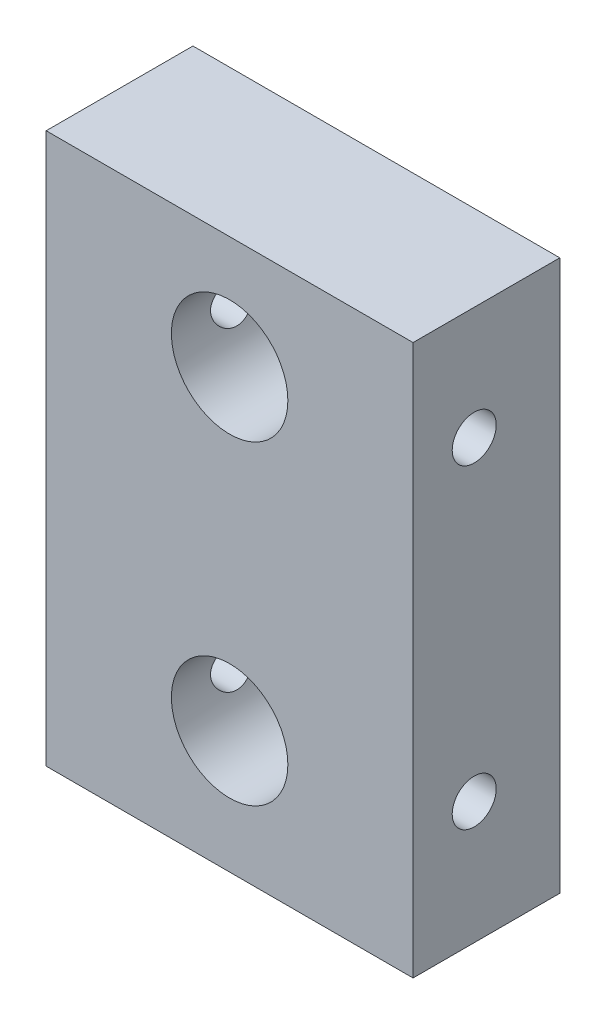
ISO-10303-21;
HEADER;
FILE_DESCRIPTION(('STEP AP214'),'2;1');
FILE_NAME('part.step','',(''),(''),'','','');
FILE_SCHEMA(('AUTOMOTIVE_DESIGN { 1 0 10303 214 1 1 1 1 }'));
ENDSEC;
DATA;
#1=APPLICATION_CONTEXT('core data for automotive mechanical design processes');
#2=APPLICATION_PROTOCOL_DEFINITION('international standard','automotive_design',2000,#1);
#3=PRODUCT_CONTEXT('',#1,'mechanical');
#4=PRODUCT('Part','Part','',(#3));
#5=PRODUCT_RELATED_PRODUCT_CATEGORY('part','',(#4));
#6=PRODUCT_DEFINITION_FORMATION('','',#4);
#7=PRODUCT_DEFINITION_CONTEXT('part definition',#1,'design');
#8=PRODUCT_DEFINITION('design','',#6,#7);
#9=PRODUCT_DEFINITION_SHAPE('','',#8);
#10=(LENGTH_UNIT() NAMED_UNIT(*) SI_UNIT(.MILLI.,.METRE.));
#11=(NAMED_UNIT(*) PLANE_ANGLE_UNIT() SI_UNIT($,.RADIAN.));
#12=(NAMED_UNIT(*) SI_UNIT($,.STERADIAN.) SOLID_ANGLE_UNIT());
#13=UNCERTAINTY_MEASURE_WITH_UNIT(LENGTH_MEASURE(1.E-05),#10,'distance_accuracy_value','');
#14=(GEOMETRIC_REPRESENTATION_CONTEXT(3) GLOBAL_UNCERTAINTY_ASSIGNED_CONTEXT((#13)) GLOBAL_UNIT_ASSIGNED_CONTEXT((#10,
#11,#12)) REPRESENTATION_CONTEXT('',''));
#15=CARTESIAN_POINT('',(0.,0.,0.));
#16=DIRECTION('',(0.,0.,1.));
#17=DIRECTION('',(1.,0.,0.));
#18=AXIS2_PLACEMENT_3D('',#15,#16,#17);
#19=CARTESIAN_POINT('',(3.76478286354874,-5.76763882139511,-184.305879912897));
#20=DIRECTION('',(0.,0.,1.));
#21=DIRECTION('',(1.,0.,0.));
#22=AXIS2_PLACEMENT_3D('',#19,#20,#21);
#23=PLANE('',#22);
#24=CARTESIAN_POINT('',(18.7647828635487,30.0023548443934,-184.305879912897));
#25=DIRECTION('',(0.,0.,1.));
#26=DIRECTION('',(1.,0.,0.));
#27=AXIS2_PLACEMENT_3D('',#24,#25,#26);
#28=CIRCLE('',#27,4.7625);
#29=CARTESIAN_POINT('',(23.5272828635487,30.0023548443934,-184.305879912897));
#30=VERTEX_POINT('',#29);
#31=EDGE_CURVE('E105',#30,#30,#28,.T.);
#32=ORIENTED_EDGE('',*,*,#31,.F.);
#33=EDGE_LOOP('',(#32));
#34=FACE_BOUND('',#33,.T.);
#35=DIRECTION('',(0.,-1.,0.));
#36=VECTOR('',#35,1.);
#37=CARTESIAN_POINT('',(3.76478286354873,39.2323611786049,-184.305879912897));
#38=LINE('',#37,#36);
#39=CARTESIAN_POINT('',(3.76478286354873,39.2323611786049,-184.305879912897));
#40=VERTEX_POINT('',#39);
#41=CARTESIAN_POINT('',(3.76478286354874,-5.76763882139511,-184.305879912897));
#42=VERTEX_POINT('',#41);
#43=EDGE_CURVE('E89',#40,#42,#38,.T.);
#44=ORIENTED_EDGE('',*,*,#43,.T.);
#45=DIRECTION('',(1.,0.,0.));
#46=VECTOR('',#45,1.);
#47=CARTESIAN_POINT('',(3.76478286354874,-5.76763882139511,-184.305879912897));
#48=LINE('',#47,#46);
#49=CARTESIAN_POINT('',(33.7647828635487,-5.76763882139511,-184.305879912897));
#50=VERTEX_POINT('',#49);
#51=EDGE_CURVE('E84',#42,#50,#48,.T.);
#52=ORIENTED_EDGE('',*,*,#51,.T.);
#53=DIRECTION('',(0.,1.,0.));
#54=VECTOR('',#53,1.);
#55=CARTESIAN_POINT('',(33.7647828635487,39.2323611786049,-184.305879912897));
#56=LINE('',#55,#54);
#57=CARTESIAN_POINT('',(33.7647828635487,39.2323611786049,-184.305879912897));
#58=VERTEX_POINT('',#57);
#59=EDGE_CURVE('E87',#50,#58,#56,.T.);
#60=ORIENTED_EDGE('',*,*,#59,.T.);
#61=DIRECTION('',(-1.,0.,0.));
#62=VECTOR('',#61,1.);
#63=CARTESIAN_POINT('',(3.76478286354873,39.2323611786049,-184.305879912897));
#64=LINE('',#63,#62);
#65=EDGE_CURVE('E54',#58,#40,#64,.T.);
#66=ORIENTED_EDGE('',*,*,#65,.T.);
#67=EDGE_LOOP('',(#44,#52,#60,#66));
#68=FACE_BOUND('',#67,.T.);
#69=CARTESIAN_POINT('',(18.7647828635477,4.23236117860423,-184.305879912897));
#70=DIRECTION('',(0.,0.,1.));
#71=DIRECTION('',(1.,0.,0.));
#72=AXIS2_PLACEMENT_3D('',#69,#70,#71);
#73=CIRCLE('',#72,4.7625);
#74=CARTESIAN_POINT('',(23.5272828635477,4.23236117860423,-184.305879912897));
#75=VERTEX_POINT('',#74);
#76=EDGE_CURVE('E181',#75,#75,#73,.T.);
#77=ORIENTED_EDGE('',*,*,#76,.F.);
#78=EDGE_LOOP('',(#77));
#79=FACE_BOUND('',#78,.T.);
#80=ADVANCED_FACE('F31',(#34,#68,#79),#23,.T.);
#81=CARTESIAN_POINT('',(3.76478286354874,-5.76763882139511,-196.305879912897));
#82=DIRECTION('',(0.,0.,1.));
#83=DIRECTION('',(1.,0.,0.));
#84=AXIS2_PLACEMENT_3D('',#81,#82,#83);
#85=PLANE('',#84);
#86=CARTESIAN_POINT('',(18.7647828635487,30.0023548443934,-196.305879912897));
#87=DIRECTION('',(0.,0.,1.));
#88=DIRECTION('',(1.,0.,0.));
#89=AXIS2_PLACEMENT_3D('',#86,#87,#88);
#90=CIRCLE('',#89,4.7625);
#91=CARTESIAN_POINT('',(23.5272828635487,30.0023548443934,-196.305879912897));
#92=VERTEX_POINT('',#91);
#93=EDGE_CURVE('E184',#92,#92,#90,.T.);
#94=ORIENTED_EDGE('',*,*,#93,.T.);
#95=EDGE_LOOP('',(#94));
#96=FACE_BOUND('',#95,.T.);
#97=DIRECTION('',(0.,-1.,0.));
#98=VECTOR('',#97,1.);
#99=CARTESIAN_POINT('',(3.76478286354873,39.2323611786049,-196.305879912897));
#100=LINE('',#99,#98);
#101=CARTESIAN_POINT('',(3.76478286354873,39.2323611786049,-196.305879912897));
#102=VERTEX_POINT('',#101);
#103=CARTESIAN_POINT('',(3.76478286354874,-5.76763882139511,-196.305879912897));
#104=VERTEX_POINT('',#103);
#105=EDGE_CURVE('E102',#102,#104,#100,.T.);
#106=ORIENTED_EDGE('',*,*,#105,.F.);
#107=DIRECTION('',(-1.,0.,0.));
#108=VECTOR('',#107,1.);
#109=CARTESIAN_POINT('',(3.76478286354873,39.2323611786049,-196.305879912897));
#110=LINE('',#109,#108);
#111=CARTESIAN_POINT('',(33.7647828635487,39.2323611786049,-196.305879912897));
#112=VERTEX_POINT('',#111);
#113=EDGE_CURVE('E77',#112,#102,#110,.T.);
#114=ORIENTED_EDGE('',*,*,#113,.F.);
#115=DIRECTION('',(0.,1.,0.));
#116=VECTOR('',#115,1.);
#117=CARTESIAN_POINT('',(33.7647828635487,39.2323611786049,-196.305879912897));
#118=LINE('',#117,#116);
#119=CARTESIAN_POINT('',(33.7647828635487,-5.76763882139511,-196.305879912897));
#120=VERTEX_POINT('',#119);
#121=EDGE_CURVE('E71',#120,#112,#118,.T.);
#122=ORIENTED_EDGE('',*,*,#121,.F.);
#123=DIRECTION('',(1.,0.,0.));
#124=VECTOR('',#123,1.);
#125=CARTESIAN_POINT('',(3.76478286354874,-5.76763882139511,-196.305879912897));
#126=LINE('',#125,#124);
#127=EDGE_CURVE('E93',#104,#120,#126,.T.);
#128=ORIENTED_EDGE('',*,*,#127,.F.);
#129=EDGE_LOOP('',(#106,#114,#122,#128));
#130=FACE_BOUND('',#129,.T.);
#131=CARTESIAN_POINT('',(18.7647828635477,4.23236117860423,-196.305879912897));
#132=DIRECTION('',(0.,0.,1.));
#133=DIRECTION('',(1.,0.,0.));
#134=AXIS2_PLACEMENT_3D('',#131,#132,#133);
#135=CIRCLE('',#134,4.7625);
#136=CARTESIAN_POINT('',(23.5272828635477,4.23236117860423,-196.305879912897));
#137=VERTEX_POINT('',#136);
#138=EDGE_CURVE('E179',#137,#137,#135,.T.);
#139=ORIENTED_EDGE('',*,*,#138,.T.);
#140=EDGE_LOOP('',(#139));
#141=FACE_BOUND('',#140,.T.);
#142=ADVANCED_FACE('F150',(#96,#130,#141),#85,.F.);
#143=CARTESIAN_POINT('',(3.76478286354873,39.2323611786049,-184.305879912897));
#144=DIRECTION('',(1.,0.,0.));
#145=DIRECTION('',(0.,1.,0.));
#146=AXIS2_PLACEMENT_3D('',#143,#144,#145);
#147=PLANE('',#146);
#148=CARTESIAN_POINT('',(3.76478286354873,30.0023611786049,-189.305879912897));
#149=DIRECTION('',(-1.,0.,0.));
#150=DIRECTION('',(0.,0.,1.));
#151=AXIS2_PLACEMENT_3D('',#148,#149,#150);
#152=CIRCLE('',#151,1.8);
#153=CARTESIAN_POINT('',(3.76478286354873,30.0023611786049,-187.505879912897));
#154=VERTEX_POINT('',#153);
#155=EDGE_CURVE('E169',#154,#154,#152,.T.);
#156=ORIENTED_EDGE('',*,*,#155,.F.);
#157=EDGE_LOOP('',(#156));
#158=FACE_BOUND('',#157,.T.);
#159=CARTESIAN_POINT('',(3.76478286354874,4.23236117860488,-189.305879912897));
#160=DIRECTION('',(-1.,0.,0.));
#161=DIRECTION('',(0.,0.,1.));
#162=AXIS2_PLACEMENT_3D('',#159,#160,#161);
#163=CIRCLE('',#162,1.8);
#164=CARTESIAN_POINT('',(3.76478286354874,4.23236117860488,-187.505879912897));
#165=VERTEX_POINT('',#164);
#166=EDGE_CURVE('E173',#165,#165,#163,.T.);
#167=ORIENTED_EDGE('',*,*,#166,.F.);
#168=EDGE_LOOP('',(#167));
#169=FACE_BOUND('',#168,.T.);
#170=ORIENTED_EDGE('',*,*,#105,.T.);
#171=DIRECTION('',(0.,0.,-1.));
#172=VECTOR('',#171,1.);
#173=CARTESIAN_POINT('',(3.76478286354874,-5.76763882139511,-184.305879912897));
#174=LINE('',#173,#172);
#175=EDGE_CURVE('E11',#42,#104,#174,.T.);
#176=ORIENTED_EDGE('',*,*,#175,.F.);
#177=ORIENTED_EDGE('',*,*,#43,.F.);
#178=DIRECTION('',(0.,0.,-1.));
#179=VECTOR('',#178,1.);
#180=CARTESIAN_POINT('',(3.76478286354873,39.2323611786049,-184.305879912897));
#181=LINE('',#180,#179);
#182=EDGE_CURVE('E98',#40,#102,#181,.T.);
#183=ORIENTED_EDGE('',*,*,#182,.T.);
#184=EDGE_LOOP('',(#170,#176,#177,#183));
#185=FACE_BOUND('',#184,.T.);
#186=ADVANCED_FACE('F33',(#158,#169,#185),#147,.F.);
#187=CARTESIAN_POINT('',(3.76478286354874,-5.76763882139511,-184.305879912897));
#188=DIRECTION('',(0.,1.,0.));
#189=DIRECTION('',(0.,0.,1.));
#190=AXIS2_PLACEMENT_3D('',#187,#188,#189);
#191=PLANE('',#190);
#192=ORIENTED_EDGE('',*,*,#127,.T.);
#193=DIRECTION('',(0.,0.,-1.));
#194=VECTOR('',#193,1.);
#195=CARTESIAN_POINT('',(33.7647828635487,-5.76763882139511,-184.305879912897));
#196=LINE('',#195,#194);
#197=EDGE_CURVE('E45',#50,#120,#196,.T.);
#198=ORIENTED_EDGE('',*,*,#197,.F.);
#199=ORIENTED_EDGE('',*,*,#51,.F.);
#200=ORIENTED_EDGE('',*,*,#175,.T.);
#201=EDGE_LOOP('',(#192,#198,#199,#200));
#202=FACE_BOUND('',#201,.T.);
#203=ADVANCED_FACE('F92',(#202),#191,.F.);
#204=CARTESIAN_POINT('',(33.7647828635487,39.2323611786049,-184.305879912897));
#205=DIRECTION('',(-1.,0.,0.));
#206=DIRECTION('',(0.,-1.,0.));
#207=AXIS2_PLACEMENT_3D('',#204,#205,#206);
#208=PLANE('',#207);
#209=CARTESIAN_POINT('',(33.7647828635487,30.0023611786049,-189.305879912897));
#210=DIRECTION('',(-1.,0.,0.));
#211=DIRECTION('',(0.,0.,1.));
#212=AXIS2_PLACEMENT_3D('',#209,#210,#211);
#213=CIRCLE('',#212,1.8);
#214=CARTESIAN_POINT('',(33.7647828635487,30.0023611786049,-187.505879912897));
#215=VERTEX_POINT('',#214);
#216=EDGE_CURVE('E140',#215,#215,#213,.T.);
#217=ORIENTED_EDGE('',*,*,#216,.T.);
#218=EDGE_LOOP('',(#217));
#219=FACE_BOUND('',#218,.T.);
#220=CARTESIAN_POINT('',(33.7647828635487,4.23236117860488,-189.305879912897));
#221=DIRECTION('',(-1.,0.,0.));
#222=DIRECTION('',(0.,0.,1.));
#223=AXIS2_PLACEMENT_3D('',#220,#221,#222);
#224=CIRCLE('',#223,1.79999999999999);
#225=CARTESIAN_POINT('',(33.7647828635487,4.23236117860488,-187.505879912897));
#226=VERTEX_POINT('',#225);
#227=EDGE_CURVE('E119',#226,#226,#224,.T.);
#228=ORIENTED_EDGE('',*,*,#227,.T.);
#229=EDGE_LOOP('',(#228));
#230=FACE_BOUND('',#229,.T.);
#231=ORIENTED_EDGE('',*,*,#121,.T.);
#232=DIRECTION('',(0.,0.,-1.));
#233=VECTOR('',#232,1.);
#234=CARTESIAN_POINT('',(33.7647828635487,39.2323611786049,-184.305879912897));
#235=LINE('',#234,#233);
#236=EDGE_CURVE('E94',#58,#112,#235,.T.);
#237=ORIENTED_EDGE('',*,*,#236,.F.);
#238=ORIENTED_EDGE('',*,*,#59,.F.);
#239=ORIENTED_EDGE('',*,*,#197,.T.);
#240=EDGE_LOOP('',(#231,#237,#238,#239));
#241=FACE_BOUND('',#240,.T.);
#242=ADVANCED_FACE('F96',(#219,#230,#241),#208,.F.);
#243=CARTESIAN_POINT('',(3.76478286354873,39.2323611786049,-184.305879912897));
#244=DIRECTION('',(0.,-1.,0.));
#245=DIRECTION('',(1.,0.,0.));
#246=AXIS2_PLACEMENT_3D('',#243,#244,#245);
#247=PLANE('',#246);
#248=ORIENTED_EDGE('',*,*,#113,.T.);
#249=ORIENTED_EDGE('',*,*,#182,.F.);
#250=ORIENTED_EDGE('',*,*,#65,.F.);
#251=ORIENTED_EDGE('',*,*,#236,.T.);
#252=EDGE_LOOP('',(#248,#249,#250,#251));
#253=FACE_BOUND('',#252,.T.);
#254=ADVANCED_FACE('F145',(#253),#247,.F.);
#255=CARTESIAN_POINT('',(18.7647828635487,30.0023548443934,-184.305879912897));
#256=DIRECTION('',(0.,0.,-1.));
#257=DIRECTION('',(-1.,0.,0.));
#258=AXIS2_PLACEMENT_3D('',#255,#256,#257);
#259=CYLINDRICAL_SURFACE('',#258,4.7625);
#260=CARTESIAN_POINT('',(14.0022828635487,30.0023548443934,-187.505879912908));
#261=CARTESIAN_POINT('',(14.002280040065,29.9049273439229,-187.505876508423));
#262=CARTESIAN_POINT('',(14.0052983956385,29.8075253246281,-187.513815328143));
#263=CARTESIAN_POINT('',(14.0170371564296,29.6156352254887,-187.545229216947));
#264=CARTESIAN_POINT('',(14.0257566415417,29.5211466780151,-187.568701779046));
#265=CARTESIAN_POINT('',(14.0479625967678,29.3378788632292,-187.630232411416));
#266=CARTESIAN_POINT('',(14.0614397785975,29.2490888671655,-187.668262074479));
#267=CARTESIAN_POINT('',(14.0918211701919,29.0791561751348,-187.757681715223));
#268=CARTESIAN_POINT('',(14.1087263140063,28.9980155723183,-187.809075335389));
#269=CARTESIAN_POINT('',(14.1450339590226,28.8421923674234,-187.92607344201));
#270=CARTESIAN_POINT('',(14.1645079057255,28.7678824634918,-187.992151920356));
#271=CARTESIAN_POINT('',(14.2034095740135,28.6310976924185,-188.135637780218));
#272=CARTESIAN_POINT('',(14.2228372792493,28.5686265314406,-188.213048695999));
#273=CARTESIAN_POINT('',(14.2602816103805,28.4549037843292,-188.380665415829));
#274=CARTESIAN_POINT('',(14.2782141812561,28.40418188299,-188.471251258652));
#275=CARTESIAN_POINT('',(14.3095242234876,28.318859154649,-188.660451904167));
#276=CARTESIAN_POINT('',(14.3229035464216,28.2842517725651,-188.759063422955));
#277=CARTESIAN_POINT('',(14.3428274125082,28.233617102971,-188.957223462423));
#278=CARTESIAN_POINT('',(14.3496327766206,28.2168777400303,-189.056562912867));
#279=CARTESIAN_POINT('',(14.3564005970731,28.2002280406462,-189.256855987745));
#280=CARTESIAN_POINT('',(14.3563659370651,28.200310612327,-189.357808914014));
#281=CARTESIAN_POINT('',(14.3496822370228,28.2167585003298,-189.551911535459));
#282=CARTESIAN_POINT('',(14.3434364466176,28.2321311396192,-189.645161824701));
#283=CARTESIAN_POINT('',(14.3257051506646,28.2770801209457,-189.827645139333));
#284=CARTESIAN_POINT('',(14.3142188432366,28.3066586367379,-189.916877547629));
#285=CARTESIAN_POINT('',(14.2870610704548,28.3797174909451,-190.090798332025));
#286=CARTESIAN_POINT('',(14.2713138364913,28.4234526400432,-190.175367316653));
#287=CARTESIAN_POINT('',(14.2374332456151,28.5234055202229,-190.336252124382));
#288=CARTESIAN_POINT('',(14.2192990566579,28.5796276087186,-190.41256505261));
#289=CARTESIAN_POINT('',(14.1811759856307,28.707482678069,-190.560259348006));
#290=CARTESIAN_POINT('',(14.1611450565278,28.7799063807807,-190.630947047893));
#291=CARTESIAN_POINT('',(14.1225497747878,28.935808686688,-190.75938176711));
#292=CARTESIAN_POINT('',(14.1039856550194,29.0192890396145,-190.817126734331));
#293=CARTESIAN_POINT('',(14.0700361849975,29.1967269267058,-190.918818083753));
#294=CARTESIAN_POINT('',(14.0547061779658,29.2908301665829,-190.962530023656));
#295=CARTESIAN_POINT('',(14.0293636322236,29.4857785877305,-191.033271319166));
#296=CARTESIAN_POINT('',(14.0193486931241,29.5866207023852,-191.060308206452));
#297=CARTESIAN_POINT('',(14.0061884256746,29.7863489647691,-191.095590413119));
#298=CARTESIAN_POINT('',(14.0027020791969,29.8850478153809,-191.104769615847));
#299=CARTESIAN_POINT('',(14.0019356512535,30.0826259164122,-191.106799566245));
#300=CARTESIAN_POINT('',(14.0046541678835,30.1815051210396,-191.099654002272));
#301=CARTESIAN_POINT('',(14.0157672071414,30.3725789546416,-191.06994450237));
#302=CARTESIAN_POINT('',(14.0239352957754,30.4648837210912,-191.047995287947));
#303=CARTESIAN_POINT('',(14.044897481716,30.6444331643464,-190.990114042673));
#304=CARTESIAN_POINT('',(14.0576921803268,30.7316771817133,-190.954180194242));
#305=CARTESIAN_POINT('',(14.087116645214,30.9015193936799,-190.868199436857));
#306=CARTESIAN_POINT('',(14.1038485783726,30.9839040811476,-190.817766813885));
#307=CARTESIAN_POINT('',(14.1393009732442,31.1393191487236,-190.704655145805));
#308=CARTESIAN_POINT('',(14.1580221759929,31.2123460203864,-190.641971529651));
#309=CARTESIAN_POINT('',(14.1967638934131,31.3514769490049,-190.501790613518));
#310=CARTESIAN_POINT('',(14.2167959450337,31.4169191406,-190.423637883854));
#311=CARTESIAN_POINT('',(14.254839695457,31.5338943394714,-190.257070248617));
#312=CARTESIAN_POINT('',(14.2728511971148,31.5854259901859,-190.168654343376));
#313=CARTESIAN_POINT('',(14.3047500886146,31.6731979264659,-189.983275868103));
#314=CARTESIAN_POINT('',(14.3186175927191,31.7093648201747,-189.886274894064));
#315=CARTESIAN_POINT('',(14.3402191774489,31.7646088756539,-189.68688764025));
#316=CARTESIAN_POINT('',(14.3479571344957,31.7836968393979,-189.584504807808));
#317=CARTESIAN_POINT('',(14.355903267246,31.8032679293619,-189.384444707315));
#318=CARTESIAN_POINT('',(14.3565691082192,31.8048820029247,-189.286895363771));
#319=CARTESIAN_POINT('',(14.3514718927663,31.7923652996866,-189.092992693222));
#320=CARTESIAN_POINT('',(14.3457094661479,31.7782360653318,-188.996639249985));
#321=CARTESIAN_POINT('',(14.3287886209759,31.7355195673962,-188.810947542132));
#322=CARTESIAN_POINT('',(14.3178058731706,31.7074016961274,-188.721483909501));
#323=CARTESIAN_POINT('',(14.2917867456654,31.6379224193923,-188.5484935587));
#324=CARTESIAN_POINT('',(14.2767493337823,31.5965576411981,-188.464968359109));
#325=CARTESIAN_POINT('',(14.2433236049197,31.4992151178711,-188.301410310379));
#326=CARTESIAN_POINT('',(14.2247999049624,31.4425789330334,-188.221797354498));
#327=CARTESIAN_POINT('',(14.1869486015758,31.3173138948449,-188.072844502495));
#328=CARTESIAN_POINT('',(14.1676207421153,31.2486811993905,-188.003507910753));
#329=CARTESIAN_POINT('',(14.1290544560577,31.0968347373402,-187.873162568695));
#330=CARTESIAN_POINT('',(14.1098801243875,31.0130243876903,-187.812826694058));
#331=CARTESIAN_POINT('',(14.0749040126437,30.8357791253441,-187.707110903561));
#332=CARTESIAN_POINT('',(14.0591025864098,30.7423432043854,-187.661732556572));
#333=CARTESIAN_POINT('',(14.0320143109463,30.5435106992932,-187.585695562001));
#334=CARTESIAN_POINT('',(14.0209926078718,30.4377497088637,-187.555886072696));
#335=CARTESIAN_POINT('',(14.0061303518676,30.2220985028979,-187.51598531841));
#336=CARTESIAN_POINT('',(14.0022860472041,30.1122104752878,-187.505883751678));
#337=CARTESIAN_POINT('',(14.0022828635487,30.0023548443934,-187.505879912908));
#338=B_SPLINE_CURVE_WITH_KNOTS('',3,(#260,#261,#262,#263,#264,#265,#266,#267,#268,#269,#270,
#271,#272,#273,#274,#275,#276,#277,#278,#279,#280,#281,#282,#283,#284,#285,#286,#287,#288,#289,
#290,#291,#292,#293,#294,#295,#296,#297,#298,#299,#300,#301,#302,#303,#304,#305,#306,#307,#308,
#309,#310,#311,#312,#313,#314,#315,#316,#317,#318,#319,#320,#321,#322,#323,#324,#325,#326,#327,
#328,#329,#330,#331,#332,#333,#334,#335,#336,#337),.UNSPECIFIED.,.T.,.F.,(4,2,2,2,2,2,2,2,2,2,2,
2,2,2,2,2,2,2,2,2,2,2,2,2,2,2,2,2,2,2,2,2,2,2,2,2,2,2,4),(0.,0.291877239919987,
0.583707385378248,0.874970923421535,1.16631393175265,1.46896048708597,1.77170163113028,
2.08619513615856,2.40056059916426,2.70186780489485,3.00304798428122,3.28587239629844,
3.56874009934315,3.85701226782774,4.14538518961246,4.45346994456128,4.76160351275317,
5.07464519929774,5.38754538950112,5.68358881869792,5.97956536754154,6.26395183969088,
6.54837528583715,6.84120464535362,7.13414347363044,7.44435084911277,7.7545884652247,
8.0662917511568,8.37779775332487,8.66901181679856,8.96019735116507,9.24221159113761,
9.52429769048672,9.82133838314633,10.1184743834529,10.4320477347225,10.7456539657325,
11.0749360695487,11.4040460044263),.UNSPECIFIED.);
#339=CARTESIAN_POINT('',(14.0022828635487,30.0023548443934,-187.505879912908));
#340=VERTEX_POINT('',#339);
#341=EDGE_CURVE('E35',#340,#340,#338,.T.);
#342=ORIENTED_EDGE('',*,*,#341,.F.);
#343=EDGE_LOOP('',(#342));
#344=FACE_BOUND('',#343,.T.);
#345=CARTESIAN_POINT('',(23.5272828635445,30.0023611786049,-187.505879912897));
#346=CARTESIAN_POINT('',(23.5272855574211,30.0997886855794,-187.505876165588));
#347=CARTESIAN_POINT('',(23.5242670718947,30.1971907354435,-187.51381464361));
#348=CARTESIAN_POINT('',(23.512528044188,30.3890809422077,-187.5452278575));
#349=CARTESIAN_POINT('',(23.5038084221109,30.4835695667274,-187.568700086392));
#350=CARTESIAN_POINT('',(23.4816021811601,30.6668375791557,-187.630230066491));
#351=CARTESIAN_POINT('',(23.4681248506304,30.7556276957709,-187.668259410354));
#352=CARTESIAN_POINT('',(23.4377431458312,30.9255606717227,-187.757678430521));
#353=CARTESIAN_POINT('',(23.4208378375072,31.0067014379202,-187.809071749317));
#354=CARTESIAN_POINT('',(23.3845298354183,31.1625250341833,-187.926069275886));
#355=CARTESIAN_POINT('',(23.3650556950816,31.2368351658919,-187.992147478863));
#356=CARTESIAN_POINT('',(23.3261536208722,31.3736204348359,-188.135632824825));
#357=CARTESIAN_POINT('',(23.3067257033434,31.4360918658516,-188.213043502151));
#358=CARTESIAN_POINT('',(23.2692809167795,31.549815234451,-188.380659828014));
#359=CARTESIAN_POINT('',(23.2513481034286,31.6005374815065,-188.471245522488));
#360=CARTESIAN_POINT('',(23.2200375830377,31.6858609208775,-188.660445945639));
#361=CARTESIAN_POINT('',(23.2066580244119,31.7204686682848,-188.759057390371));
#362=CARTESIAN_POINT('',(23.1867337308542,31.7711040514684,-188.957217349514));
#363=CARTESIAN_POINT('',(23.1799281726281,31.7878437652695,-189.056556789535));
#364=CARTESIAN_POINT('',(23.1731600183777,31.8044941542507,-189.256849915072));
#365=CARTESIAN_POINT('',(23.1731945385889,31.804411921532,-189.357802902368));
#366=CARTESIAN_POINT('',(23.1798780349878,31.7879646751393,-189.55190557012));
#367=CARTESIAN_POINT('',(23.1861237489682,31.7725923602987,-189.645155843271));
#368=CARTESIAN_POINT('',(23.2038549515667,31.7276440358751,-189.827639176021));
#369=CARTESIAN_POINT('',(23.2153412420652,31.6980658525617,-189.916871618539));
#370=CARTESIAN_POINT('',(23.2424990362198,31.6250076992144,-190.090792458169));
#371=CARTESIAN_POINT('',(23.2582463069365,31.5812729279613,-190.175361469085));
#372=CARTESIAN_POINT('',(23.292127037269,31.4813208219732,-190.33624639014));
#373=CARTESIAN_POINT('',(23.3102613289546,31.4250991298179,-190.412559405417));
#374=CARTESIAN_POINT('',(23.3483847038659,31.2972448267184,-190.560254027518));
#375=CARTESIAN_POINT('',(23.3684158397172,31.2248214821514,-190.63094196096));
#376=CARTESIAN_POINT('',(23.4070116131703,31.0689198677227,-190.75937721304));
#377=CARTESIAN_POINT('',(23.4255760178957,30.9854398479753,-190.817122479403));
#378=CARTESIAN_POINT('',(23.4595261651186,30.8080024307441,-190.918814591972));
#379=CARTESIAN_POINT('',(23.4748565593829,30.7138993105478,-190.962526970855));
#380=CARTESIAN_POINT('',(23.5001999200844,30.5189510332452,-191.033269151902));
#381=CARTESIAN_POINT('',(23.5102152868811,30.4181089427834,-191.060306485703));
#382=CARTESIAN_POINT('',(23.5233764012797,30.2183805917051,-191.095589551408));
#383=CARTESIAN_POINT('',(23.5268631643717,30.119681632672,-191.104769162116));
#384=CARTESIAN_POINT('',(23.5276304068211,29.9221032256876,-191.106799877142));
#385=CARTESIAN_POINT('',(23.5249122881528,29.823223823551,-191.099654670003));
#386=CARTESIAN_POINT('',(23.5137999976388,29.632149673213,-191.069945820164));
#387=CARTESIAN_POINT('',(23.5056322693527,29.5398447862724,-191.047996923511));
#388=CARTESIAN_POINT('',(23.4846707669697,29.3602950457406,-190.990116276651));
#389=CARTESIAN_POINT('',(23.4718763915908,29.2730508515512,-190.954182708941));
#390=CARTESIAN_POINT('',(23.4424525557417,29.1032083649533,-190.868202540678));
#391=CARTESIAN_POINT('',(23.4257209321256,29.0208235677316,-190.817770244334));
#392=CARTESIAN_POINT('',(23.390269102516,28.8654082268489,-190.704659219398));
#393=CARTESIAN_POINT('',(23.3715481554776,28.7923811915607,-190.641975919823));
#394=CARTESIAN_POINT('',(23.3328068991359,28.6532498845551,-190.501795654221));
#395=CARTESIAN_POINT('',(23.3127750488928,28.5878074734518,-190.423643259532));
#396=CARTESIAN_POINT('',(23.2747316113145,28.4708317723261,-190.257076280815));
#397=CARTESIAN_POINT('',(23.256720221139,28.4192998390203,-190.168660696999));
#398=CARTESIAN_POINT('',(23.224821425563,28.3315272002679,-189.983282700847));
#399=CARTESIAN_POINT('',(23.2109539117566,28.2953599097681,-189.886281872126));
#400=CARTESIAN_POINT('',(23.189352218339,28.2401150391259,-189.686894844695));
#401=CARTESIAN_POINT('',(23.1816141624391,28.221026657236,-189.584512093292));
#402=CARTESIAN_POINT('',(23.1736677611199,28.2014547351581,-189.384451928134));
#403=CARTESIAN_POINT('',(23.1730017644825,28.1998402714123,-189.286902441377));
#404=CARTESIAN_POINT('',(23.1780986443259,28.2123562497552,-189.092999415246));
#405=CARTESIAN_POINT('',(23.1838608909562,28.2264851492813,-188.996645759638));
#406=CARTESIAN_POINT('',(23.2007813718544,28.2692010440185,-188.810953635937));
#407=CARTESIAN_POINT('',(23.2117639323086,28.2973186361497,-188.721489799207));
#408=CARTESIAN_POINT('',(23.23778268735,28.366797411299,-188.548499000682));
#409=CARTESIAN_POINT('',(23.2528199141078,28.4081619670158,-188.464973557437));
#410=CARTESIAN_POINT('',(23.2862452498207,28.505504029756,-188.301415093141));
#411=CARTESIAN_POINT('',(23.3047687386836,28.5621399624445,-188.221801953131));
#412=CARTESIAN_POINT('',(23.3426196307597,28.6874045298094,-188.072848696073));
#413=CARTESIAN_POINT('',(23.3619472900049,28.7560370065564,-188.003511883357));
#414=CARTESIAN_POINT('',(23.400513170778,28.9078830193586,-187.873166086304));
#415=CARTESIAN_POINT('',(23.4196872987629,28.9916931352211,-187.812829970136));
#416=CARTESIAN_POINT('',(23.4546630242457,29.1689379612357,-187.707113654472));
#417=CARTESIAN_POINT('',(23.4704642678982,29.2623736796754,-187.661735023877));
#418=CARTESIAN_POINT('',(23.4975521950808,29.4612058371498,-187.585697395378));
#419=CARTESIAN_POINT('',(23.5085737319308,29.5669666866411,-187.555887558891));
#420=CARTESIAN_POINT('',(23.5234356715525,29.7826176642792,-187.515986081154));
#421=CARTESIAN_POINT('',(23.5272798260311,29.8925056044828,-187.505884138221));
#422=CARTESIAN_POINT('',(23.5272828635445,30.0023611786049,-187.505879912897));
#423=B_SPLINE_CURVE_WITH_KNOTS('',3,(#345,#346,#347,#348,#349,#350,#351,#352,#353,#354,#355,
#356,#357,#358,#359,#360,#361,#362,#363,#364,#365,#366,#367,#368,#369,#370,#371,#372,#373,#374,
#375,#376,#377,#378,#379,#380,#381,#382,#383,#384,#385,#386,#387,#388,#389,#390,#391,#392,#393,
#394,#395,#396,#397,#398,#399,#400,#401,#402,#403,#404,#405,#406,#407,#408,#409,#410,#411,#412,
#413,#414,#415,#416,#417,#418,#419,#420,#421,#422),.UNSPECIFIED.,.T.,.F.,(4,2,2,2,2,2,2,2,2,2,2,
2,2,2,2,2,2,2,2,2,2,2,2,2,2,2,2,2,2,2,2,2,2,2,2,2,2,2,4),(0.,0.291877259616568,
0.583707424956104,0.874970980646802,1.16631400664004,1.46896063675766,1.77170185737394,
2.08619560184695,2.40056130385687,2.70186868829862,3.00304904237177,3.28587323306893,
3.56874071428979,3.85701245960489,4.14538495836119,4.4534695640114,4.76160298709372,
5.07464506957661,5.38754565620551,5.68358956051224,5.9795665812164,6.26395308816136,
6.54837656744407,6.84120554224921,7.13414398403379,7.4443509068543,7.75458807385302,
8.06629137518937,8.37779739663543,8.66901190878269,8.96019788972868,9.24221239134021,
9.52429875146562,9.82133933709536,10.1184752292544,10.4320483277192,10.7456543066219,
11.0749362396456,11.4040460046809),.UNSPECIFIED.);
#424=CARTESIAN_POINT('',(23.5272828635445,30.0023611786049,-187.505879912897));
#425=VERTEX_POINT('',#424);
#426=EDGE_CURVE('E136',#425,#425,#423,.T.);
#427=ORIENTED_EDGE('',*,*,#426,.F.);
#428=EDGE_LOOP('',(#427));
#429=FACE_BOUND('',#428,.T.);
#430=ORIENTED_EDGE('',*,*,#31,.T.);
#431=EDGE_LOOP('',(#430));
#432=FACE_BOUND('',#431,.T.);
#433=ORIENTED_EDGE('',*,*,#93,.F.);
#434=EDGE_LOOP('',(#433));
#435=FACE_BOUND('',#434,.T.);
#436=ADVANCED_FACE('F141',(#344,#429,#432,#435),#259,.F.);
#437=CARTESIAN_POINT('',(18.7647828635477,4.23236117860423,-184.305879912897));
#438=DIRECTION('',(0.,0.,-1.));
#439=DIRECTION('',(-1.,0.,0.));
#440=AXIS2_PLACEMENT_3D('',#437,#438,#439);
#441=CYLINDRICAL_SURFACE('',#440,4.7625);
#442=CARTESIAN_POINT('',(14.0022828635477,4.23236117860423,-187.505879912897));
#443=CARTESIAN_POINT('',(14.0022800400615,4.13493369908773,-187.505876165555));
#444=CARTESIAN_POINT('',(14.0052983943439,4.037531672819,-187.513814639104));
#445=CARTESIAN_POINT('',(14.0170371602625,3.84564150419018,-187.545227839049));
#446=CARTESIAN_POINT('',(14.025756651772,3.75115289419998,-187.568700058407));
#447=CARTESIAN_POINT('',(14.0479626366635,3.56788490173671,-187.630230018138));
#448=CARTESIAN_POINT('',(14.0614398417561,3.47909479064553,-187.668259351366));
#449=CARTESIAN_POINT('',(14.0918213035815,3.3091618207905,-187.757678350318));
#450=CARTESIAN_POINT('',(14.1087264943715,3.22802105516609,-187.809071658536));
#451=CARTESIAN_POINT('',(14.1450342637393,3.0721974742008,-187.926069150702));
#452=CARTESIAN_POINT('',(14.1645082889025,2.99788735503048,-187.992147327164));
#453=CARTESIAN_POINT('',(14.203410147651,2.86110210517286,-188.135632613027));
#454=CARTESIAN_POINT('',(14.2228379648972,2.79863068068825,-188.213043256753));
#455=CARTESIAN_POINT('',(14.2602825694642,2.68490731249383,-188.380659513421));
#456=CARTESIAN_POINT('',(14.2782153016955,2.6341850603372,-188.471245172919));
#457=CARTESIAN_POINT('',(14.3095256882071,2.54886160173564,-188.66044551909));
#458=CARTESIAN_POINT('',(14.3229051940373,2.51425384028925,-188.759056921866));
#459=CARTESIAN_POINT('',(14.3428294232802,2.46361840375589,-188.957216847251));
#460=CARTESIAN_POINT('',(14.349634965442,2.44687865973536,-189.056556298122));
#461=CARTESIAN_POINT('',(14.3564031144287,2.43022821477264,-189.256849449213));
#462=CARTESIAN_POINT('',(14.3563686049903,2.43031042176824,-189.357802451217));
#463=CARTESIAN_POINT('',(14.3496851525772,2.44675762720937,-189.55190519244));
#464=CARTESIAN_POINT('',(14.3434394678427,2.462129932578,-189.645155523357));
#465=CARTESIAN_POINT('',(14.3257083387956,2.50707825690681,-189.827638973209));
#466=CARTESIAN_POINT('',(14.3142220926091,2.53665644958839,-189.916871475067));
#467=CARTESIAN_POINT('',(14.2870644037693,2.60971463523859,-190.090792416634));
#468=CARTESIAN_POINT('',(14.2713171950258,2.65344942740637,-190.175361471224));
#469=CARTESIAN_POINT('',(14.2374366023587,2.75340159093263,-190.33624647468));
#470=CARTESIAN_POINT('',(14.2193023863734,2.80962331970011,-190.412559528696));
#471=CARTESIAN_POINT('',(14.181179191189,2.93747768197193,-190.560254184726));
#472=CARTESIAN_POINT('',(14.161148160634,3.00990104409732,-190.6309421179));
#473=CARTESIAN_POINT('',(14.1225526114873,3.16580269539066,-190.759377364984));
#474=CARTESIAN_POINT('',(14.1039883257693,3.24928273440896,-190.817122626661));
#475=CARTESIAN_POINT('',(14.0700384367128,3.42672015407626,-190.918814703933));
#476=CARTESIAN_POINT('',(14.054708180443,3.52082325384011,-190.962527057828));
#477=CARTESIAN_POINT('',(14.0293651000495,3.71577147858774,-191.033269196233));
#478=CARTESIAN_POINT('',(14.0193498755666,3.81661353693522,-191.060306512371));
#479=CARTESIAN_POINT('',(14.0061890366901,4.01634181832943,-191.095589555984));
#480=CARTESIAN_POINT('',(14.0027024071421,4.11504074057701,-191.104769160894));
#481=CARTESIAN_POINT('',(14.0019354267486,4.31261906582017,-191.106799877853));
#482=CARTESIAN_POINT('',(14.004653673946,4.4114984230035,-191.099654678398));
#483=CARTESIAN_POINT('',(14.0157662103593,4.60257251831707,-191.069945854395));
#484=CARTESIAN_POINT('',(14.0239340584417,4.69487739428287,-191.047996969539));
#485=CARTESIAN_POINT('',(14.0448957944886,4.8744271110437,-190.990116352185));
#486=CARTESIAN_POINT('',(14.0576902837409,4.96167129242947,-190.954182802164));
#487=CARTESIAN_POINT('',(14.0871143485546,5.13151378594903,-190.868202660277));
#488=CARTESIAN_POINT('',(14.1038460883308,5.21389860026343,-190.817770367929));
#489=CARTESIAN_POINT('',(14.1392981424085,5.36931397405748,-190.704659347283));
#490=CARTESIAN_POINT('',(14.1580191977554,5.44234102514751,-190.641976047979));
#491=CARTESIAN_POINT('',(14.1967606687218,5.58147237421516,-190.501795767594));
#492=CARTESIAN_POINT('',(14.2167926246559,5.64691480989073,-190.42364335587));
#493=CARTESIAN_POINT('',(14.2548362560115,5.76389055514337,-190.257076332009));
#494=CARTESIAN_POINT('',(14.2728477342734,5.81542250801475,-190.168660720091));
#495=CARTESIAN_POINT('',(14.3047466777379,5.90319516646903,-189.983282679117));
#496=CARTESIAN_POINT('',(14.3186142522873,5.9393624609676,-189.886281835661));
#497=CARTESIAN_POINT('',(14.3402160380831,5.99460733473412,-189.68689477227));
#498=CARTESIAN_POINT('',(14.3479541256721,6.01369571585161,-189.584511999677));
#499=CARTESIAN_POINT('',(14.355900554049,6.03326762379155,-189.384451846109));
#500=CARTESIAN_POINT('',(14.3565665517076,6.03488208345067,-189.286902393237));
#501=CARTESIAN_POINT('',(14.3514696520911,6.02236610800749,-189.092999435592));
#502=CARTESIAN_POINT('',(14.3457073846705,6.00823721547095,-188.996645814584));
#503=CARTESIAN_POINT('',(14.3287868448184,5.96552135094216,-188.810953778568));
#504=CARTESIAN_POINT('',(14.3178042479333,5.93740378461558,-188.721489994114));
#505=CARTESIAN_POINT('',(14.2917854046909,5.86792507906235,-188.548499295517));
#506=CARTESIAN_POINT('',(14.2767481261569,5.82656056713377,-188.464973899926));
#507=CARTESIAN_POINT('',(14.2433226634117,5.72921859624302,-188.301415497189));
#508=CARTESIAN_POINT('',(14.2247990976022,5.6725827082753,-188.221802373318));
#509=CARTESIAN_POINT('',(14.1869480346471,5.54731824004826,-188.07284913933));
#510=CARTESIAN_POINT('',(14.1676202814626,5.47868581769635,-188.003512333563));
#511=CARTESIAN_POINT('',(14.129054180445,5.32683988337887,-187.873166502603));
#512=CARTESIAN_POINT('',(14.1098799258496,5.24302978600683,-187.812830351512));
#513=CARTESIAN_POINT('',(14.0749039334932,5.06578498829732,-187.707113962787));
#514=CARTESIAN_POINT('',(14.0591025495951,4.97234927961774,-187.661735294138));
#515=CARTESIAN_POINT('',(14.0320143144041,4.77351704711586,-187.585697554965));
#516=CARTESIAN_POINT('',(14.0209926138752,4.66775610589027,-187.555887660369));
#517=CARTESIAN_POINT('',(14.0061303561542,4.45210492357233,-187.515986102928));
#518=CARTESIAN_POINT('',(14.0022860472083,4.34221687045922,-187.505884138263));
#519=CARTESIAN_POINT('',(14.0022828635477,4.23236117860423,-187.505879912897));
#520=B_SPLINE_CURVE_WITH_KNOTS('',3,(#442,#443,#444,#445,#446,#447,#448,#449,#450,#451,#452,
#453,#454,#455,#456,#457,#458,#459,#460,#461,#462,#463,#464,#465,#466,#467,#468,#469,#470,#471,
#472,#473,#474,#475,#476,#477,#478,#479,#480,#481,#482,#483,#484,#485,#486,#487,#488,#489,#490,
#491,#492,#493,#494,#495,#496,#497,#498,#499,#500,#501,#502,#503,#504,#505,#506,#507,#508,#509,
#510,#511,#512,#513,#514,#515,#516,#517,#518,#519),.UNSPECIFIED.,.T.,.F.,(4,2,2,2,2,2,2,2,2,2,2,
2,2,2,2,2,2,2,2,2,2,2,2,2,2,2,2,2,2,2,2,2,2,2,2,2,2,2,4),(0.,0.291877177100622,
0.583707258736567,0.874970734769667,1.16631368115176,1.46896016610648,1.77170124112812,
2.0861948631045,2.40056044436233,2.70186787354932,3.00304827308173,3.28587262293836,
3.56874026310783,3.85701212000371,4.14538472999226,4.45346931000708,4.761602706455,
5.07464464293567,5.38754508376037,5.68358886406822,5.9795657615608,6.26395226000637,
6.54837573119876,6.84120480228137,7.13414334088923,7.44435040866655,7.75458772038062,
8.06629108935565,8.37779717658595,8.66901158681855,8.96019746577817,9.24221180972706,
9.52429801231717,9.8213385270498,10.1184743489121,10.4320475329111,10.7456535991009,
11.0749358866713,11.4040460041268),.UNSPECIFIED.);
#521=CARTESIAN_POINT('',(14.0022828635477,4.23236117860423,-187.505879912897));
#522=VERTEX_POINT('',#521);
#523=EDGE_CURVE('E118',#522,#522,#520,.T.);
#524=ORIENTED_EDGE('',*,*,#523,.F.);
#525=EDGE_LOOP('',(#524));
#526=FACE_BOUND('',#525,.T.);
#527=CARTESIAN_POINT('',(23.5272828635477,4.23236117860488,-187.505879912897));
#528=CARTESIAN_POINT('',(23.5272856870339,4.32978865812138,-187.505876165555));
#529=CARTESIAN_POINT('',(23.5242673327515,4.42719068439012,-187.513814639104));
#530=CARTESIAN_POINT('',(23.5125285668329,4.61908085301895,-187.545227839049));
#531=CARTESIAN_POINT('',(23.5038090753234,4.71356946300915,-187.568700058407));
#532=CARTESIAN_POINT('',(23.4816030904318,4.89683745547244,-187.630230018138));
#533=CARTESIAN_POINT('',(23.4681258853392,4.98562756656362,-187.668259351366));
#534=CARTESIAN_POINT('',(23.4377444235138,5.15556053641868,-187.757678350317));
#535=CARTESIAN_POINT('',(23.4208392327237,5.23670130204312,-187.809071658536));
#536=CARTESIAN_POINT('',(23.3845314633559,5.39252488300845,-187.926069150702));
#537=CARTESIAN_POINT('',(23.3650574381927,5.46683500217879,-187.992147327164));
#538=CARTESIAN_POINT('',(23.3261555794442,5.60362025203646,-188.135632613027));
#539=CARTESIAN_POINT('',(23.3067277621979,5.6660916765211,-188.213043256752));
#540=CARTESIAN_POINT('',(23.2692831576309,5.77981504471558,-188.38065951342));
#541=CARTESIAN_POINT('',(23.2513504253996,5.83053729687223,-188.471245172918));
#542=CARTESIAN_POINT('',(23.220040038888,5.91586075547388,-188.660445519089));
#543=CARTESIAN_POINT('',(23.2066605330578,5.95046851692031,-188.759056921865));
#544=CARTESIAN_POINT('',(23.1867363038148,6.00110395345374,-188.957216847251));
#545=CARTESIAN_POINT('',(23.179930761653,6.0178436974743,-189.056556298121));
#546=CARTESIAN_POINT('',(23.1731626126662,6.0344941424371,-189.256849449212));
#547=CARTESIAN_POINT('',(23.1731971221046,6.03441193544154,-189.357802451216));
#548=CARTESIAN_POINT('',(23.1798805745177,6.01796473000047,-189.55190519244));
#549=CARTESIAN_POINT('',(23.1861262592521,6.00259242463188,-189.645155523357));
#550=CARTESIAN_POINT('',(23.2038573882993,5.95764410030314,-189.827638973208));
#551=CARTESIAN_POINT('',(23.2153436344858,5.92806590762159,-189.916871475067));
#552=CARTESIAN_POINT('',(23.2425013233256,5.85500772197145,-190.090792416634));
#553=CARTESIAN_POINT('',(23.2582485320691,5.81127292980371,-190.175361471224));
#554=CARTESIAN_POINT('',(23.2921291247361,5.71132076627752,-190.33624647468));
#555=CARTESIAN_POINT('',(23.3102633407214,5.65509903751009,-190.412559528695));
#556=CARTESIAN_POINT('',(23.3483865359059,5.52724467523835,-190.560254184726));
#557=CARTESIAN_POINT('',(23.3684175664609,5.454821313113,-190.630942117899));
#558=CARTESIAN_POINT('',(23.4070131156077,5.29891966181972,-190.759377364983));
#559=CARTESIAN_POINT('',(23.4255774013257,5.21543962280146,-190.817122626661));
#560=CARTESIAN_POINT('',(23.4595272903823,5.0380022031342,-190.918814703933));
#561=CARTESIAN_POINT('',(23.4748575466521,4.94389910337037,-190.962527057828));
#562=CARTESIAN_POINT('',(23.5002006270457,4.74895087862276,-191.033269196233));
#563=CARTESIAN_POINT('',(23.5102158515287,4.64810882027529,-191.06030651237));
#564=CARTESIAN_POINT('',(23.5233766904052,4.44838053888107,-191.095589555984));
#565=CARTESIAN_POINT('',(23.5268633199533,4.34968161663348,-191.104769160894));
#566=CARTESIAN_POINT('',(23.5276303003468,4.15210329139029,-191.106799877853));
#567=CARTESIAN_POINT('',(23.5249120531495,4.05322393420693,-191.099654678398));
#568=CARTESIAN_POINT('',(23.5137995167363,3.86214983889333,-191.069945854395));
#569=CARTESIAN_POINT('',(23.5056316686539,3.76984496292753,-191.047996969539));
#570=CARTESIAN_POINT('',(23.4846699326071,3.59029524616667,-190.990116352185));
#571=CARTESIAN_POINT('',(23.4718754433548,3.50305106478088,-190.954182802164));
#572=CARTESIAN_POINT('',(23.4424513785412,3.33320857126128,-190.868202660277));
#573=CARTESIAN_POINT('',(23.425719638765,3.25082375694687,-190.81777036793));
#574=CARTESIAN_POINT('',(23.3902675846874,3.09540838315279,-190.704659347283));
#575=CARTESIAN_POINT('',(23.3715465293405,3.02238133206274,-190.64197604798));
#576=CARTESIAN_POINT('',(23.3328050583741,2.88324998299505,-190.501795767594));
#577=CARTESIAN_POINT('',(23.3127731024401,2.81780754731947,-190.423643355871));
#578=CARTESIAN_POINT('',(23.2747294710845,2.70083180206677,-190.257076332009));
#579=CARTESIAN_POINT('',(23.2567179928227,2.64929984919536,-190.168660720091));
#580=CARTESIAN_POINT('',(23.2248190493581,2.561527190741,-189.983282679117));
#581=CARTESIAN_POINT('',(23.2109514748087,2.52535989624238,-189.886281835662));
#582=CARTESIAN_POINT('',(23.1893496890129,2.47011502247579,-189.686894772271));
#583=CARTESIAN_POINT('',(23.1816116014238,2.45102664135826,-189.584511999677));
#584=CARTESIAN_POINT('',(23.1736651730469,2.43145473341824,-189.38445184611));
#585=CARTESIAN_POINT('',(23.1729991753884,2.42984027375907,-189.286902393238));
#586=CARTESIAN_POINT('',(23.1780960750048,2.44235624920218,-189.092999435592));
#587=CARTESIAN_POINT('',(23.1838583424254,2.45648514173869,-188.996645814584));
#588=CARTESIAN_POINT('',(23.2007788822774,2.49920100626742,-188.810953778568));
#589=CARTESIAN_POINT('',(23.2117614791625,2.52731857259397,-188.721489994114));
#590=CARTESIAN_POINT('',(23.2377803224049,2.59679727814715,-188.548499295518));
#591=CARTESIAN_POINT('',(23.2528176009389,2.63816179007571,-188.464973899927));
#592=CARTESIAN_POINT('',(23.286243063684,2.73550376096641,-188.301415497189));
#593=CARTESIAN_POINT('',(23.3047666294935,2.7921396489341,-188.221802373318));
#594=CARTESIAN_POINT('',(23.3426176924486,2.91740411716108,-188.07284913933));
#595=CARTESIAN_POINT('',(23.3619454456331,2.98603653951297,-188.003512333564));
#596=CARTESIAN_POINT('',(23.4005115466506,3.13788247383042,-187.873166502604));
#597=CARTESIAN_POINT('',(23.419685801246,3.22169257120244,-187.812830351512));
#598=CARTESIAN_POINT('',(23.4546617936024,3.39893736891191,-187.707113962787));
#599=CARTESIAN_POINT('',(23.4704631775005,3.49237307759146,-187.661735294138));
#600=CARTESIAN_POINT('',(23.4975514126914,3.6912053100933,-187.585697554965));
#601=CARTESIAN_POINT('',(23.5085731132203,3.79696625131888,-187.555887660369));
#602=CARTESIAN_POINT('',(23.5234353709413,4.0126174336368,-187.515986102928));
#603=CARTESIAN_POINT('',(23.5272796798871,4.1225054867499,-187.505884138263));
#604=CARTESIAN_POINT('',(23.5272828635477,4.23236117860488,-187.505879912897));
#605=B_SPLINE_CURVE_WITH_KNOTS('',3,(#527,#528,#529,#530,#531,#532,#533,#534,#535,#536,#537,
#538,#539,#540,#541,#542,#543,#544,#545,#546,#547,#548,#549,#550,#551,#552,#553,#554,#555,#556,
#557,#558,#559,#560,#561,#562,#563,#564,#565,#566,#567,#568,#569,#570,#571,#572,#573,#574,#575,
#576,#577,#578,#579,#580,#581,#582,#583,#584,#585,#586,#587,#588,#589,#590,#591,#592,#593,#594,
#595,#596,#597,#598,#599,#600,#601,#602,#603,#604),.UNSPECIFIED.,.T.,.F.,(4,2,2,2,2,2,2,2,2,2,2,
2,2,2,2,2,2,2,2,2,2,2,2,2,2,2,2,2,2,2,2,2,2,2,2,2,2,2,4),(0.,0.291877177100629,
0.583707258736564,0.87497073476966,1.16631368115176,1.46896016610648,1.77170124112812,
2.08619486310451,2.40056044436238,2.70186787354938,3.00304827308183,3.28587262293842,
3.56874026310791,3.85701212000375,4.14538472999225,4.45346931000705,4.76160270645496,
5.07464464293565,5.38754508376039,5.6835888640683,5.97956576156091,6.26395226000647,
6.54837573119889,6.84120480228145,7.13414334088926,7.44435040866655,7.75458772038057,
8.06629108935567,8.37779717658591,8.66901158681851,8.96019746577822,9.24221180972714,
9.52429801231729,9.8213385270499,10.1184743489122,10.4320475329112,10.745653599101,
11.0749358866713,11.4040460041268),.UNSPECIFIED.);
#606=CARTESIAN_POINT('',(23.5272828635477,4.23236117860488,-187.505879912897));
#607=VERTEX_POINT('',#606);
#608=EDGE_CURVE('E111',#607,#607,#605,.T.);
#609=ORIENTED_EDGE('',*,*,#608,.F.);
#610=EDGE_LOOP('',(#609));
#611=FACE_BOUND('',#610,.T.);
#612=ORIENTED_EDGE('',*,*,#76,.T.);
#613=EDGE_LOOP('',(#612));
#614=FACE_BOUND('',#613,.T.);
#615=ORIENTED_EDGE('',*,*,#138,.F.);
#616=EDGE_LOOP('',(#615));
#617=FACE_BOUND('',#616,.T.);
#618=ADVANCED_FACE('F122',(#526,#611,#614,#617),#441,.F.);
#619=CARTESIAN_POINT('',(3.76478286354874,4.23236117860488,-189.305879912897));
#620=DIRECTION('',(-1.,0.,0.));
#621=DIRECTION('',(0.,0.,1.));
#622=AXIS2_PLACEMENT_3D('',#619,#620,#621);
#623=CYLINDRICAL_SURFACE('',#622,1.79999999999999);
#624=ORIENTED_EDGE('',*,*,#608,.T.);
#625=EDGE_LOOP('',(#624));
#626=FACE_BOUND('',#625,.T.);
#627=ORIENTED_EDGE('',*,*,#227,.F.);
#628=EDGE_LOOP('',(#627));
#629=FACE_BOUND('',#628,.T.);
#630=ADVANCED_FACE('F124',(#626,#629),#623,.F.);
#631=ORIENTED_EDGE('',*,*,#523,.T.);
#632=EDGE_LOOP('',(#631));
#633=FACE_BOUND('',#632,.T.);
#634=ORIENTED_EDGE('',*,*,#166,.T.);
#635=EDGE_LOOP('',(#634));
#636=FACE_BOUND('',#635,.T.);
#637=ADVANCED_FACE('F127',(#633,#636),#623,.F.);
#638=CARTESIAN_POINT('',(3.76478286354873,30.0023611786049,-189.305879912897));
#639=DIRECTION('',(-1.,0.,0.));
#640=DIRECTION('',(0.,0.,1.));
#641=AXIS2_PLACEMENT_3D('',#638,#639,#640);
#642=CYLINDRICAL_SURFACE('',#641,1.8);
#643=ORIENTED_EDGE('',*,*,#426,.T.);
#644=EDGE_LOOP('',(#643));
#645=FACE_BOUND('',#644,.T.);
#646=ORIENTED_EDGE('',*,*,#216,.F.);
#647=EDGE_LOOP('',(#646));
#648=FACE_BOUND('',#647,.T.);
#649=ADVANCED_FACE('F129',(#645,#648),#642,.F.);
#650=ORIENTED_EDGE('',*,*,#341,.T.);
#651=EDGE_LOOP('',(#650));
#652=FACE_BOUND('',#651,.T.);
#653=ORIENTED_EDGE('',*,*,#155,.T.);
#654=EDGE_LOOP('',(#653));
#655=FACE_BOUND('',#654,.T.);
#656=ADVANCED_FACE('F133',(#652,#655),#642,.F.);
#657=CLOSED_SHELL('',(#80,#142,#186,#203,#242,#254,#436,#618,#630,#637,#649,#656));
#658=MANIFOLD_SOLID_BREP('B2',#657);
#659=ADVANCED_BREP_SHAPE_REPRESENTATION('',(#18,#658),#14);
#660=SHAPE_DEFINITION_REPRESENTATION(#9,#659);
ENDSEC;
END-ISO-10303-21;
